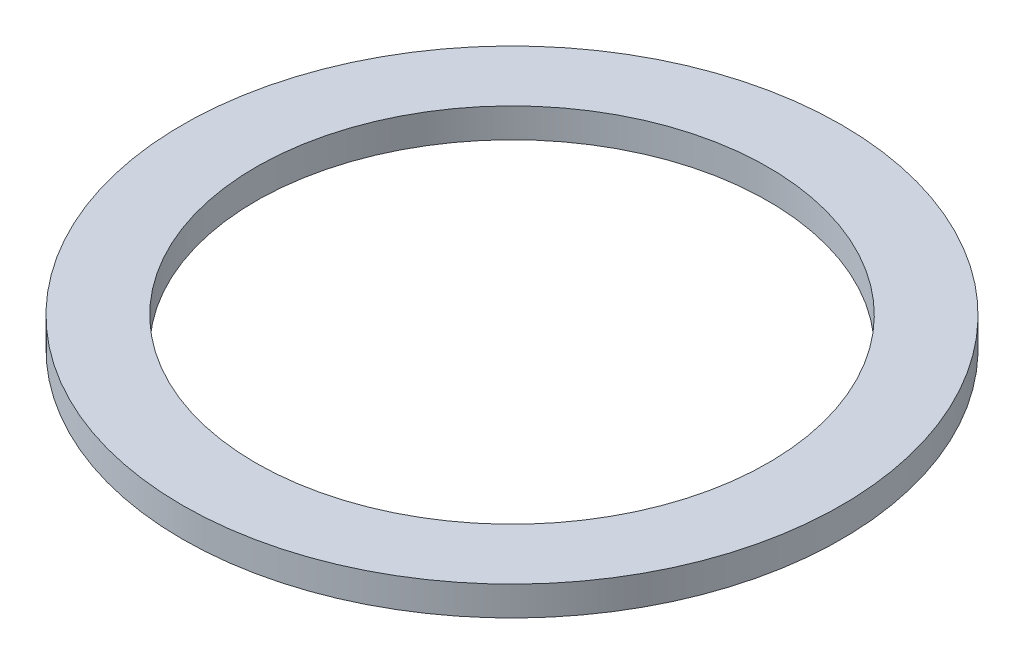
ISO-10303-21;
HEADER;
FILE_DESCRIPTION(('STEP AP214'),'2;1');
FILE_NAME('part.step','',(''),(''),'','','');
FILE_SCHEMA(('AUTOMOTIVE_DESIGN { 1 0 10303 214 1 1 1 1 }'));
ENDSEC;
DATA;
#1=APPLICATION_CONTEXT('core data for automotive mechanical design processes');
#2=APPLICATION_PROTOCOL_DEFINITION('international standard','automotive_design',2000,#1);
#3=PRODUCT_CONTEXT('',#1,'mechanical');
#4=PRODUCT('Part','Part','',(#3));
#5=PRODUCT_RELATED_PRODUCT_CATEGORY('part','',(#4));
#6=PRODUCT_DEFINITION_FORMATION('','',#4);
#7=PRODUCT_DEFINITION_CONTEXT('part definition',#1,'design');
#8=PRODUCT_DEFINITION('design','',#6,#7);
#9=PRODUCT_DEFINITION_SHAPE('','',#8);
#10=(LENGTH_UNIT() NAMED_UNIT(*) SI_UNIT(.MILLI.,.METRE.));
#11=(NAMED_UNIT(*) PLANE_ANGLE_UNIT() SI_UNIT($,.RADIAN.));
#12=(NAMED_UNIT(*) SI_UNIT($,.STERADIAN.) SOLID_ANGLE_UNIT());
#13=UNCERTAINTY_MEASURE_WITH_UNIT(LENGTH_MEASURE(1.E-05),#10,'distance_accuracy_value','');
#14=(GEOMETRIC_REPRESENTATION_CONTEXT(3) GLOBAL_UNCERTAINTY_ASSIGNED_CONTEXT((#13)) GLOBAL_UNIT_ASSIGNED_CONTEXT((#10,
#11,#12)) REPRESENTATION_CONTEXT('',''));
#15=CARTESIAN_POINT('',(0.,0.,0.));
#16=DIRECTION('',(0.,0.,1.));
#17=DIRECTION('',(1.,0.,0.));
#18=AXIS2_PLACEMENT_3D('',#15,#16,#17);
#19=CARTESIAN_POINT('',(0.,2.,0.));
#20=DIRECTION('',(0.,1.,0.));
#21=DIRECTION('',(0.,0.,1.));
#22=AXIS2_PLACEMENT_3D('',#19,#20,#21);
#23=PLANE('',#22);
#24=CARTESIAN_POINT('',(0.,2.,0.));
#25=DIRECTION('',(0.,1.,0.));
#26=DIRECTION('',(0.,0.,1.));
#27=AXIS2_PLACEMENT_3D('',#24,#25,#26);
#28=CIRCLE('',#27,22.46);
#29=CARTESIAN_POINT('',(0.,2.,22.46));
#30=VERTEX_POINT('',#29);
#31=EDGE_CURVE('E10',#30,#30,#28,.T.);
#32=ORIENTED_EDGE('',*,*,#31,.T.);
#33=EDGE_LOOP('',(#32));
#34=FACE_BOUND('',#33,.T.);
#35=CARTESIAN_POINT('',(0.,2.,0.));
#36=DIRECTION('',(0.,1.,0.));
#37=DIRECTION('',(0.,0.,1.));
#38=AXIS2_PLACEMENT_3D('',#35,#36,#37);
#39=CIRCLE('',#38,17.46);
#40=CARTESIAN_POINT('',(0.,2.,17.46));
#41=VERTEX_POINT('',#40);
#42=EDGE_CURVE('E42',#41,#41,#39,.T.);
#43=ORIENTED_EDGE('',*,*,#42,.F.);
#44=EDGE_LOOP('',(#43));
#45=FACE_BOUND('',#44,.T.);
#46=ADVANCED_FACE('F31',(#34,#45),#23,.T.);
#47=CARTESIAN_POINT('',(0.,0.,0.));
#48=DIRECTION('',(0.,1.,0.));
#49=DIRECTION('',(0.,0.,1.));
#50=AXIS2_PLACEMENT_3D('',#47,#48,#49);
#51=PLANE('',#50);
#52=CARTESIAN_POINT('',(0.,0.,0.));
#53=DIRECTION('',(0.,1.,0.));
#54=DIRECTION('',(0.,0.,1.));
#55=AXIS2_PLACEMENT_3D('',#52,#53,#54);
#56=CIRCLE('',#55,22.46);
#57=CARTESIAN_POINT('',(0.,0.,22.46));
#58=VERTEX_POINT('',#57);
#59=EDGE_CURVE('E35',#58,#58,#56,.T.);
#60=ORIENTED_EDGE('',*,*,#59,.F.);
#61=EDGE_LOOP('',(#60));
#62=FACE_BOUND('',#61,.T.);
#63=CARTESIAN_POINT('',(0.,0.,0.));
#64=DIRECTION('',(0.,1.,0.));
#65=DIRECTION('',(0.,0.,1.));
#66=AXIS2_PLACEMENT_3D('',#63,#64,#65);
#67=CIRCLE('',#66,17.46);
#68=CARTESIAN_POINT('',(0.,0.,17.46));
#69=VERTEX_POINT('',#68);
#70=EDGE_CURVE('E44',#69,#69,#67,.T.);
#71=ORIENTED_EDGE('',*,*,#70,.T.);
#72=EDGE_LOOP('',(#71));
#73=FACE_BOUND('',#72,.T.);
#74=ADVANCED_FACE('F54',(#62,#73),#51,.F.);
#75=CARTESIAN_POINT('',(0.,2.,0.));
#76=DIRECTION('',(0.,-1.,0.));
#77=DIRECTION('',(0.,0.,-1.));
#78=AXIS2_PLACEMENT_3D('',#75,#76,#77);
#79=CYLINDRICAL_SURFACE('',#78,22.46);
#80=ORIENTED_EDGE('',*,*,#31,.F.);
#81=EDGE_LOOP('',(#80));
#82=FACE_BOUND('',#81,.T.);
#83=ORIENTED_EDGE('',*,*,#59,.T.);
#84=EDGE_LOOP('',(#83));
#85=FACE_BOUND('',#84,.T.);
#86=ADVANCED_FACE('F33',(#82,#85),#79,.T.);
#87=CARTESIAN_POINT('',(0.,2.,0.));
#88=DIRECTION('',(0.,-1.,0.));
#89=DIRECTION('',(0.,0.,-1.));
#90=AXIS2_PLACEMENT_3D('',#87,#88,#89);
#91=CYLINDRICAL_SURFACE('',#90,17.46);
#92=ORIENTED_EDGE('',*,*,#42,.T.);
#93=EDGE_LOOP('',(#92));
#94=FACE_BOUND('',#93,.T.);
#95=ORIENTED_EDGE('',*,*,#70,.F.);
#96=EDGE_LOOP('',(#95));
#97=FACE_BOUND('',#96,.T.);
#98=ADVANCED_FACE('F50',(#94,#97),#91,.F.);
#99=CLOSED_SHELL('',(#46,#74,#86,#98));
#100=MANIFOLD_SOLID_BREP('B2',#99);
#101=ADVANCED_BREP_SHAPE_REPRESENTATION('',(#18,#100),#14);
#102=SHAPE_DEFINITION_REPRESENTATION(#9,#101);
ENDSEC;
END-ISO-10303-21;
